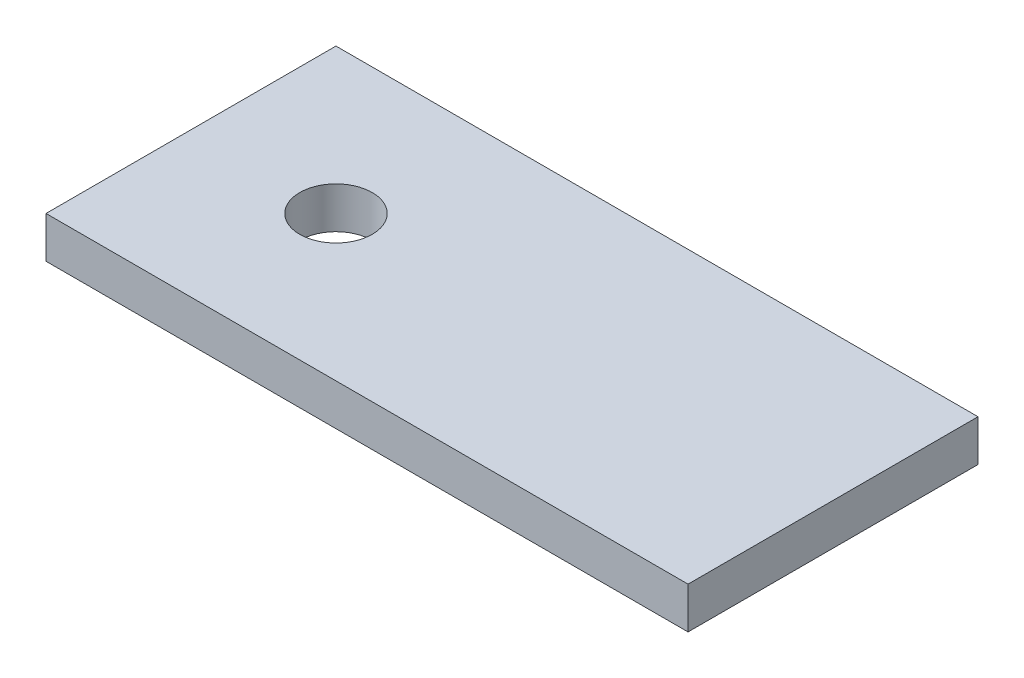
ISO-10303-21;
HEADER;
FILE_DESCRIPTION(('STEP AP214'),'2;1');
FILE_NAME('part.step','',(''),(''),'','','');
FILE_SCHEMA(('AUTOMOTIVE_DESIGN { 1 0 10303 214 1 1 1 1 }'));
ENDSEC;
DATA;
#1=APPLICATION_CONTEXT('core data for automotive mechanical design processes');
#2=APPLICATION_PROTOCOL_DEFINITION('international standard','automotive_design',2000,#1);
#3=PRODUCT_CONTEXT('',#1,'mechanical');
#4=PRODUCT('Part','Part','',(#3));
#5=PRODUCT_RELATED_PRODUCT_CATEGORY('part','',(#4));
#6=PRODUCT_DEFINITION_FORMATION('','',#4);
#7=PRODUCT_DEFINITION_CONTEXT('part definition',#1,'design');
#8=PRODUCT_DEFINITION('design','',#6,#7);
#9=PRODUCT_DEFINITION_SHAPE('','',#8);
#10=(LENGTH_UNIT() NAMED_UNIT(*) SI_UNIT(.MILLI.,.METRE.));
#11=(NAMED_UNIT(*) PLANE_ANGLE_UNIT() SI_UNIT($,.RADIAN.));
#12=(NAMED_UNIT(*) SI_UNIT($,.STERADIAN.) SOLID_ANGLE_UNIT());
#13=UNCERTAINTY_MEASURE_WITH_UNIT(LENGTH_MEASURE(1.E-05),#10,'distance_accuracy_value','');
#14=(GEOMETRIC_REPRESENTATION_CONTEXT(3) GLOBAL_UNCERTAINTY_ASSIGNED_CONTEXT((#13)) GLOBAL_UNIT_ASSIGNED_CONTEXT((#10,
#11,#12)) REPRESENTATION_CONTEXT('',''));
#15=CARTESIAN_POINT('',(0.,0.,0.));
#16=DIRECTION('',(0.,0.,1.));
#17=DIRECTION('',(1.,0.,0.));
#18=AXIS2_PLACEMENT_3D('',#15,#16,#17);
#19=CARTESIAN_POINT('',(0.,2.,0.));
#20=DIRECTION('',(0.,-1.,0.));
#21=DIRECTION('',(0.,0.,-1.));
#22=AXIS2_PLACEMENT_3D('',#19,#20,#21);
#23=PLANE('',#22);
#24=DIRECTION('',(0.,0.,-1.));
#25=VECTOR('',#24,1.);
#26=CARTESIAN_POINT('',(0.,2.,0.));
#27=LINE('',#26,#25);
#28=CARTESIAN_POINT('',(0.,2.,14.));
#29=VERTEX_POINT('',#28);
#30=CARTESIAN_POINT('',(0.,2.,0.));
#31=VERTEX_POINT('',#30);
#32=EDGE_CURVE('E92',#29,#31,#27,.T.);
#33=ORIENTED_EDGE('',*,*,#32,.T.);
#34=DIRECTION('',(-1.,0.,0.));
#35=VECTOR('',#34,1.);
#36=CARTESIAN_POINT('',(0.,2.,0.));
#37=LINE('',#36,#35);
#38=CARTESIAN_POINT('',(-31.,2.,0.));
#39=VERTEX_POINT('',#38);
#40=EDGE_CURVE('E87',#31,#39,#37,.T.);
#41=ORIENTED_EDGE('',*,*,#40,.T.);
#42=DIRECTION('',(0.,0.,1.));
#43=VECTOR('',#42,1.);
#44=CARTESIAN_POINT('',(-31.,2.,0.));
#45=LINE('',#44,#43);
#46=CARTESIAN_POINT('',(-31.,2.,14.));
#47=VERTEX_POINT('',#46);
#48=EDGE_CURVE('E90',#39,#47,#45,.T.);
#49=ORIENTED_EDGE('',*,*,#48,.T.);
#50=DIRECTION('',(1.,0.,0.));
#51=VECTOR('',#50,1.);
#52=CARTESIAN_POINT('',(0.,2.,14.));
#53=LINE('',#52,#51);
#54=EDGE_CURVE('E57',#47,#29,#53,.T.);
#55=ORIENTED_EDGE('',*,*,#54,.T.);
#56=EDGE_LOOP('',(#33,#41,#49,#55));
#57=FACE_BOUND('',#56,.T.);
#58=CARTESIAN_POINT('',(-24.,2.,7.));
#59=DIRECTION('',(0.,1.,0.));
#60=DIRECTION('',(0.,0.,1.));
#61=AXIS2_PLACEMENT_3D('',#58,#59,#60);
#62=CIRCLE('',#61,1.75);
#63=CARTESIAN_POINT('',(-24.,2.,8.75));
#64=VERTEX_POINT('',#63);
#65=EDGE_CURVE('E112',#64,#64,#62,.T.);
#66=ORIENTED_EDGE('',*,*,#65,.F.);
#67=EDGE_LOOP('',(#66));
#68=FACE_BOUND('',#67,.T.);
#69=ADVANCED_FACE('F39',(#57,#68),#23,.F.);
#70=CARTESIAN_POINT('',(0.,0.,0.));
#71=DIRECTION('',(0.,-1.,0.));
#72=DIRECTION('',(0.,0.,-1.));
#73=AXIS2_PLACEMENT_3D('',#70,#71,#72);
#74=PLANE('',#73);
#75=DIRECTION('',(0.,0.,-1.));
#76=VECTOR('',#75,1.);
#77=CARTESIAN_POINT('',(0.,0.,0.));
#78=LINE('',#77,#76);
#79=CARTESIAN_POINT('',(0.,0.,14.));
#80=VERTEX_POINT('',#79);
#81=CARTESIAN_POINT('',(0.,0.,0.));
#82=VERTEX_POINT('',#81);
#83=EDGE_CURVE('E108',#80,#82,#78,.T.);
#84=ORIENTED_EDGE('',*,*,#83,.F.);
#85=DIRECTION('',(1.,0.,0.));
#86=VECTOR('',#85,1.);
#87=CARTESIAN_POINT('',(0.,0.,14.));
#88=LINE('',#87,#86);
#89=CARTESIAN_POINT('',(-31.,0.,14.));
#90=VERTEX_POINT('',#89);
#91=EDGE_CURVE('E80',#90,#80,#88,.T.);
#92=ORIENTED_EDGE('',*,*,#91,.F.);
#93=DIRECTION('',(0.,0.,1.));
#94=VECTOR('',#93,1.);
#95=CARTESIAN_POINT('',(-31.,0.,0.));
#96=LINE('',#95,#94);
#97=CARTESIAN_POINT('',(-31.,0.,0.));
#98=VERTEX_POINT('',#97);
#99=EDGE_CURVE('E74',#98,#90,#96,.T.);
#100=ORIENTED_EDGE('',*,*,#99,.F.);
#101=DIRECTION('',(-1.,0.,0.));
#102=VECTOR('',#101,1.);
#103=CARTESIAN_POINT('',(0.,0.,0.));
#104=LINE('',#103,#102);
#105=EDGE_CURVE('E97',#82,#98,#104,.T.);
#106=ORIENTED_EDGE('',*,*,#105,.F.);
#107=EDGE_LOOP('',(#84,#92,#100,#106));
#108=FACE_BOUND('',#107,.T.);
#109=CARTESIAN_POINT('',(-24.,0.,7.));
#110=DIRECTION('',(0.,1.,0.));
#111=DIRECTION('',(0.,0.,1.));
#112=AXIS2_PLACEMENT_3D('',#109,#110,#111);
#113=CIRCLE('',#112,1.75);
#114=CARTESIAN_POINT('',(-24.,0.,8.75));
#115=VERTEX_POINT('',#114);
#116=EDGE_CURVE('E130',#115,#115,#113,.T.);
#117=ORIENTED_EDGE('',*,*,#116,.T.);
#118=EDGE_LOOP('',(#117));
#119=FACE_BOUND('',#118,.T.);
#120=ADVANCED_FACE('F125',(#108,#119),#74,.T.);
#121=CARTESIAN_POINT('',(0.,2.,0.));
#122=DIRECTION('',(-1.,0.,0.));
#123=DIRECTION('',(0.,0.,1.));
#124=AXIS2_PLACEMENT_3D('',#121,#122,#123);
#125=PLANE('',#124);
#126=ORIENTED_EDGE('',*,*,#83,.T.);
#127=DIRECTION('',(0.,-1.,0.));
#128=VECTOR('',#127,1.);
#129=CARTESIAN_POINT('',(0.,2.,0.));
#130=LINE('',#129,#128);
#131=EDGE_CURVE('E11',#31,#82,#130,.T.);
#132=ORIENTED_EDGE('',*,*,#131,.F.);
#133=ORIENTED_EDGE('',*,*,#32,.F.);
#134=DIRECTION('',(0.,-1.,0.));
#135=VECTOR('',#134,1.);
#136=CARTESIAN_POINT('',(0.,2.,14.));
#137=LINE('',#136,#135);
#138=EDGE_CURVE('E104',#29,#80,#137,.T.);
#139=ORIENTED_EDGE('',*,*,#138,.T.);
#140=EDGE_LOOP('',(#126,#132,#133,#139));
#141=FACE_BOUND('',#140,.T.);
#142=ADVANCED_FACE('F41',(#141),#125,.F.);
#143=CARTESIAN_POINT('',(0.,2.,0.));
#144=DIRECTION('',(0.,0.,1.));
#145=DIRECTION('',(1.,0.,0.));
#146=AXIS2_PLACEMENT_3D('',#143,#144,#145);
#147=PLANE('',#146);
#148=ORIENTED_EDGE('',*,*,#105,.T.);
#149=DIRECTION('',(0.,-1.,0.));
#150=VECTOR('',#149,1.);
#151=CARTESIAN_POINT('',(-31.,2.,0.));
#152=LINE('',#151,#150);
#153=EDGE_CURVE('E49',#39,#98,#152,.T.);
#154=ORIENTED_EDGE('',*,*,#153,.F.);
#155=ORIENTED_EDGE('',*,*,#40,.F.);
#156=ORIENTED_EDGE('',*,*,#131,.T.);
#157=EDGE_LOOP('',(#148,#154,#155,#156));
#158=FACE_BOUND('',#157,.T.);
#159=ADVANCED_FACE('F96',(#158),#147,.F.);
#160=CARTESIAN_POINT('',(-31.,2.,0.));
#161=DIRECTION('',(1.,0.,0.));
#162=DIRECTION('',(0.,0.,-1.));
#163=AXIS2_PLACEMENT_3D('',#160,#161,#162);
#164=PLANE('',#163);
#165=ORIENTED_EDGE('',*,*,#99,.T.);
#166=DIRECTION('',(0.,-1.,0.));
#167=VECTOR('',#166,1.);
#168=CARTESIAN_POINT('',(-31.,2.,14.));
#169=LINE('',#168,#167);
#170=EDGE_CURVE('E99',#47,#90,#169,.T.);
#171=ORIENTED_EDGE('',*,*,#170,.F.);
#172=ORIENTED_EDGE('',*,*,#48,.F.);
#173=ORIENTED_EDGE('',*,*,#153,.T.);
#174=EDGE_LOOP('',(#165,#171,#172,#173));
#175=FACE_BOUND('',#174,.T.);
#176=ADVANCED_FACE('F100',(#175),#164,.F.);
#177=CARTESIAN_POINT('',(0.,2.,14.));
#178=DIRECTION('',(0.,0.,-1.));
#179=DIRECTION('',(-1.,0.,0.));
#180=AXIS2_PLACEMENT_3D('',#177,#178,#179);
#181=PLANE('',#180);
#182=ORIENTED_EDGE('',*,*,#91,.T.);
#183=ORIENTED_EDGE('',*,*,#138,.F.);
#184=ORIENTED_EDGE('',*,*,#54,.F.);
#185=ORIENTED_EDGE('',*,*,#170,.T.);
#186=EDGE_LOOP('',(#182,#183,#184,#185));
#187=FACE_BOUND('',#186,.T.);
#188=ADVANCED_FACE('F122',(#187),#181,.F.);
#189=CARTESIAN_POINT('',(-24.,2.,7.));
#190=DIRECTION('',(0.,-1.,0.));
#191=DIRECTION('',(0.,0.,-1.));
#192=AXIS2_PLACEMENT_3D('',#189,#190,#191);
#193=CYLINDRICAL_SURFACE('',#192,1.75);
#194=ORIENTED_EDGE('',*,*,#65,.T.);
#195=EDGE_LOOP('',(#194));
#196=FACE_BOUND('',#195,.T.);
#197=ORIENTED_EDGE('',*,*,#116,.F.);
#198=EDGE_LOOP('',(#197));
#199=FACE_BOUND('',#198,.T.);
#200=ADVANCED_FACE('F138',(#196,#199),#193,.F.);
#201=CLOSED_SHELL('',(#69,#120,#142,#159,#176,#188,#200));
#202=MANIFOLD_SOLID_BREP('B2',#201);
#203=ADVANCED_BREP_SHAPE_REPRESENTATION('',(#18,#202),#14);
#204=SHAPE_DEFINITION_REPRESENTATION(#9,#203);
ENDSEC;
END-ISO-10303-21;
